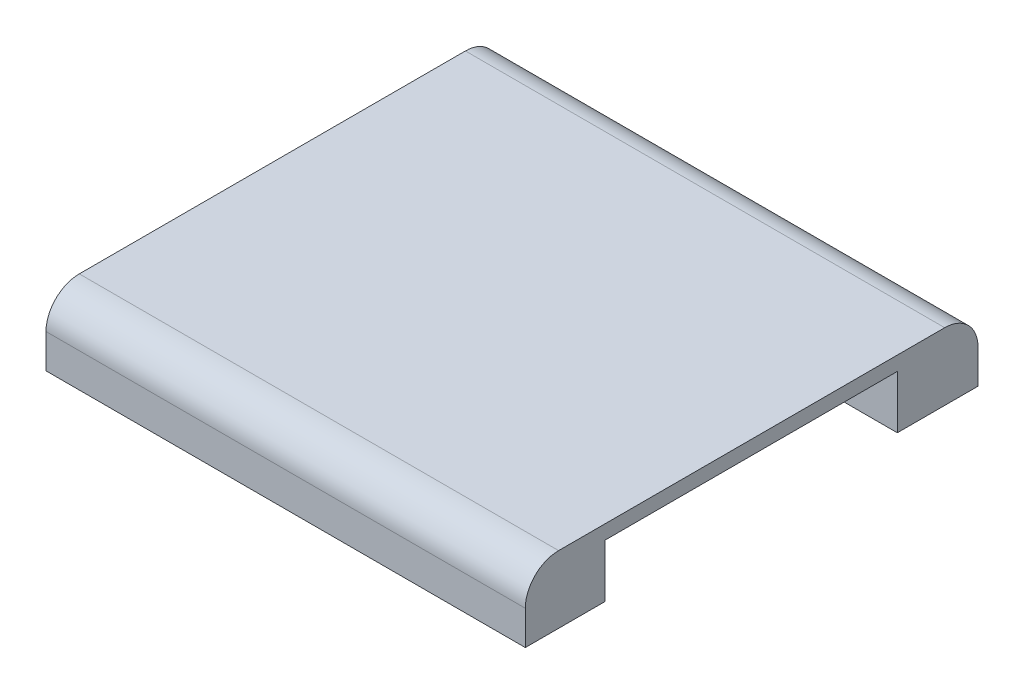
ISO-10303-21;
HEADER;
FILE_DESCRIPTION(('STEP AP214'),'2;1');
FILE_NAME('part.step','',(''),(''),'','','');
FILE_SCHEMA(('AUTOMOTIVE_DESIGN { 1 0 10303 214 1 1 1 1 }'));
ENDSEC;
DATA;
#1=APPLICATION_CONTEXT('core data for automotive mechanical design processes');
#2=APPLICATION_PROTOCOL_DEFINITION('international standard','automotive_design',2000,#1);
#3=PRODUCT_CONTEXT('',#1,'mechanical');
#4=PRODUCT('Part','Part','',(#3));
#5=PRODUCT_RELATED_PRODUCT_CATEGORY('part','',(#4));
#6=PRODUCT_DEFINITION_FORMATION('','',#4);
#7=PRODUCT_DEFINITION_CONTEXT('part definition',#1,'design');
#8=PRODUCT_DEFINITION('design','',#6,#7);
#9=PRODUCT_DEFINITION_SHAPE('','',#8);
#10=(LENGTH_UNIT() NAMED_UNIT(*) SI_UNIT(.MILLI.,.METRE.));
#11=(NAMED_UNIT(*) PLANE_ANGLE_UNIT() SI_UNIT($,.RADIAN.));
#12=(NAMED_UNIT(*) SI_UNIT($,.STERADIAN.) SOLID_ANGLE_UNIT());
#13=UNCERTAINTY_MEASURE_WITH_UNIT(LENGTH_MEASURE(1.E-05),#10,'distance_accuracy_value','');
#14=(GEOMETRIC_REPRESENTATION_CONTEXT(3) GLOBAL_UNCERTAINTY_ASSIGNED_CONTEXT((#13)) GLOBAL_UNIT_ASSIGNED_CONTEXT((#10,
#11,#12)) REPRESENTATION_CONTEXT('',''));
#15=CARTESIAN_POINT('',(0.,0.,0.));
#16=DIRECTION('',(0.,0.,1.));
#17=DIRECTION('',(1.,0.,0.));
#18=AXIS2_PLACEMENT_3D('',#15,#16,#17);
#19=CARTESIAN_POINT('',(18.,-0.0578125220072959,28.0241501159373));
#20=DIRECTION('',(0.,1.,0.));
#21=DIRECTION('',(0.,0.,1.));
#22=AXIS2_PLACEMENT_3D('',#19,#20,#21);
#23=PLANE('',#22);
#24=DIRECTION('',(0.,0.,-1.));
#25=VECTOR('',#24,1.);
#26=CARTESIAN_POINT('',(-18.,-0.0578125220072959,34.));
#27=LINE('',#26,#25);
#28=CARTESIAN_POINT('',(-18.,-0.0578125220072959,34.));
#29=VERTEX_POINT('',#28);
#30=CARTESIAN_POINT('',(-18.,-0.0578125220072959,28.0241501159373));
#31=VERTEX_POINT('',#30);
#32=EDGE_CURVE('E402',#29,#31,#27,.T.);
#33=ORIENTED_EDGE('',*,*,#32,.T.);
#34=DIRECTION('',(1.,0.,0.));
#35=VECTOR('',#34,1.);
#36=CARTESIAN_POINT('',(-40.325568237644,-0.0578125220072959,28.0241501159373));
#37=LINE('',#36,#35);
#38=CARTESIAN_POINT('',(18.,-0.0578125220072959,28.0241501159373));
#39=VERTEX_POINT('',#38);
#40=EDGE_CURVE('E11',#31,#39,#37,.T.);
#41=ORIENTED_EDGE('',*,*,#40,.T.);
#42=DIRECTION('',(0.,0.,-1.));
#43=VECTOR('',#42,1.);
#44=CARTESIAN_POINT('',(18.,-0.0578125220072959,34.));
#45=LINE('',#44,#43);
#46=CARTESIAN_POINT('',(18.,-0.0578125220072959,34.));
#47=VERTEX_POINT('',#46);
#48=EDGE_CURVE('E51',#47,#39,#45,.T.);
#49=ORIENTED_EDGE('',*,*,#48,.F.);
#50=DIRECTION('',(-1.,0.,0.));
#51=VECTOR('',#50,1.);
#52=CARTESIAN_POINT('',(0.,-0.0578125220072959,34.));
#53=LINE('',#52,#51);
#54=EDGE_CURVE('E401',#47,#29,#53,.T.);
#55=ORIENTED_EDGE('',*,*,#54,.T.);
#56=EDGE_LOOP('',(#33,#41,#49,#55));
#57=FACE_BOUND('',#56,.T.);
#58=DIRECTION('',(0.,0.,-1.));
#59=VECTOR('',#58,1.);
#60=CARTESIAN_POINT('',(17.,-0.0578125220072959,34.));
#61=LINE('',#60,#59);
#62=CARTESIAN_POINT('',(17.,-0.0578125220072959,33.));
#63=VERTEX_POINT('',#62);
#64=CARTESIAN_POINT('',(17.,-0.0578125220072959,28.1128841797272));
#65=VERTEX_POINT('',#64);
#66=EDGE_CURVE('E433',#63,#65,#61,.T.);
#67=ORIENTED_EDGE('',*,*,#66,.T.);
#68=DIRECTION('',(1.,0.,0.));
#69=VECTOR('',#68,1.);
#70=CARTESIAN_POINT('',(42.7386337284101,-0.0578125220072959,28.1128841797272));
#71=LINE('',#70,#69);
#72=CARTESIAN_POINT('',(-17.,-0.0578125220072959,28.1128841797272));
#73=VERTEX_POINT('',#72);
#74=EDGE_CURVE('E406',#73,#65,#71,.T.);
#75=ORIENTED_EDGE('',*,*,#74,.F.);
#76=DIRECTION('',(0.,0.,-1.));
#77=VECTOR('',#76,1.);
#78=CARTESIAN_POINT('',(-17.,-0.0578125220072959,34.));
#79=LINE('',#78,#77);
#80=CARTESIAN_POINT('',(-17.,-0.0578125220072959,33.));
#81=VERTEX_POINT('',#80);
#82=EDGE_CURVE('E416',#81,#73,#79,.T.);
#83=ORIENTED_EDGE('',*,*,#82,.F.);
#84=DIRECTION('',(-1.,0.,0.));
#85=VECTOR('',#84,1.);
#86=CARTESIAN_POINT('',(0.,-0.0578125220072959,33.));
#87=LINE('',#86,#85);
#88=CARTESIAN_POINT('',(7.80627689891058,-0.0578125220072959,33.));
#89=VERTEX_POINT('',#88);
#90=EDGE_CURVE('E417',#89,#81,#87,.T.);
#91=ORIENTED_EDGE('',*,*,#90,.F.);
#92=DIRECTION('',(-0.707040858821482,0.,0.707172697406356));
#93=VECTOR('',#92,1.);
#94=CARTESIAN_POINT('',(7.80627689891058,-0.0578125220072959,33.));
#95=LINE('',#94,#93);
#96=CARTESIAN_POINT('',(7.83796469042223,-0.0578125220072959,32.9683062998148));
#97=VERTEX_POINT('',#96);
#98=EDGE_CURVE('E397',#97,#89,#95,.T.);
#99=ORIENTED_EDGE('',*,*,#98,.F.);
#100=DIRECTION('',(1.,0.,0.));
#101=VECTOR('',#100,1.);
#102=CARTESIAN_POINT('',(13.9400122350262,-0.0578125220072959,32.9683062998148));
#103=LINE('',#102,#101);
#104=CARTESIAN_POINT('',(4.85968181109299,-0.0578125220072959,32.9683062998148));
#105=VERTEX_POINT('',#104);
#106=EDGE_CURVE('E413',#105,#97,#103,.T.);
#107=ORIENTED_EDGE('',*,*,#106,.F.);
#108=DIRECTION('',(-0.68267317744641,0.,0.73072384167702));
#109=VECTOR('',#108,1.);
#110=CARTESIAN_POINT('',(4.85968181109299,-0.0578125220072959,32.9683062998148));
#111=LINE('',#110,#109);
#112=CARTESIAN_POINT('',(7.40340874838498,-0.0578125220072959,30.2455364866692));
#113=VERTEX_POINT('',#112);
#114=EDGE_CURVE('E420',#113,#105,#111,.T.);
#115=ORIENTED_EDGE('',*,*,#114,.F.);
#116=DIRECTION('',(-1.,0.,0.));
#117=VECTOR('',#116,1.);
#118=CARTESIAN_POINT('',(12.3591776077276,-0.0578125220072959,30.2455364866692));
#119=LINE('',#118,#117);
#120=CARTESIAN_POINT('',(13.9400122350262,-0.0578125220072959,30.2455364866692));
#121=VERTEX_POINT('',#120);
#122=EDGE_CURVE('E423',#121,#113,#119,.T.);
#123=ORIENTED_EDGE('',*,*,#122,.F.);
#124=DIRECTION('',(0.,0.,-1.));
#125=VECTOR('',#124,1.);
#126=CARTESIAN_POINT('',(13.9400122350262,-0.0578125220072959,30.2455364866692));
#127=LINE('',#126,#125);
#128=CARTESIAN_POINT('',(13.9400122350262,-0.0578125220072959,32.9683062998148));
#129=VERTEX_POINT('',#128);
#130=EDGE_CURVE('E422',#129,#121,#127,.T.);
#131=ORIENTED_EDGE('',*,*,#130,.F.);
#132=DIRECTION('',(1.,0.,0.));
#133=VECTOR('',#132,1.);
#134=CARTESIAN_POINT('',(13.9400122350262,-0.0578125220072959,32.9683062998148));
#135=LINE('',#134,#133);
#136=CARTESIAN_POINT('',(11.5237850289689,-0.0578125220072959,32.9683062998148));
#137=VERTEX_POINT('',#136);
#138=EDGE_CURVE('E415',#137,#129,#135,.T.);
#139=ORIENTED_EDGE('',*,*,#138,.F.);
#140=DIRECTION('',(0.,0.,-1.));
#141=VECTOR('',#140,1.);
#142=CARTESIAN_POINT('',(11.5237850289689,-0.0578125220072959,31.9372937490459));
#143=LINE('',#142,#141);
#144=CARTESIAN_POINT('',(11.5237850289689,-0.0578125220072959,33.));
#145=VERTEX_POINT('',#144);
#146=EDGE_CURVE('E412',#145,#137,#143,.T.);
#147=ORIENTED_EDGE('',*,*,#146,.F.);
#148=DIRECTION('',(-1.,0.,0.));
#149=VECTOR('',#148,1.);
#150=CARTESIAN_POINT('',(0.,-0.0578125220072959,33.));
#151=LINE('',#150,#149);
#152=EDGE_CURVE('E419',#63,#145,#151,.T.);
#153=ORIENTED_EDGE('',*,*,#152,.F.);
#154=EDGE_LOOP('',(#67,#75,#83,#91,#99,#107,#115,#123,#131,#139,#147,#153));
#155=FACE_BOUND('',#154,.T.);
#156=ADVANCED_FACE('F34',(#57,#155),#23,.F.);
#157=DIRECTION('',(1.,0.,0.));
#158=VECTOR('',#157,1.);
#159=CARTESIAN_POINT('',(-40.325568237644,-0.0578125220072959,6.05869530103713));
#160=LINE('',#159,#158);
#161=CARTESIAN_POINT('',(-18.,-0.0578125220072959,6.05869530103713));
#162=VERTEX_POINT('',#161);
#163=CARTESIAN_POINT('',(18.,-0.0578125220072959,6.05869530103713));
#164=VERTEX_POINT('',#163);
#165=EDGE_CURVE('E252',#162,#164,#160,.T.);
#166=ORIENTED_EDGE('',*,*,#165,.F.);
#167=CARTESIAN_POINT('',(-18.,-0.0578125220072959,0.));
#168=VERTEX_POINT('',#167);
#169=EDGE_CURVE('E398',#162,#168,#27,.T.);
#170=ORIENTED_EDGE('',*,*,#169,.T.);
#171=DIRECTION('',(-1.,0.,0.));
#172=VECTOR('',#171,1.);
#173=CARTESIAN_POINT('',(0.,-0.0578125220072959,0.));
#174=LINE('',#173,#172);
#175=CARTESIAN_POINT('',(18.,-0.0578125220072959,0.));
#176=VERTEX_POINT('',#175);
#177=EDGE_CURVE('E403',#176,#168,#174,.T.);
#178=ORIENTED_EDGE('',*,*,#177,.F.);
#179=EDGE_CURVE('E405',#164,#176,#45,.T.);
#180=ORIENTED_EDGE('',*,*,#179,.F.);
#181=EDGE_LOOP('',(#166,#170,#178,#180));
#182=FACE_BOUND('',#181,.T.);
#183=DIRECTION('',(-1.,0.,0.));
#184=VECTOR('',#183,1.);
#185=CARTESIAN_POINT('',(42.7386337284101,-0.0578125220072959,4.11288417972719));
#186=LINE('',#185,#184);
#187=CARTESIAN_POINT('',(17.,-0.0578125220072959,4.11288417972719));
#188=VERTEX_POINT('',#187);
#189=CARTESIAN_POINT('',(-17.,-0.0578125220072959,4.11288417972719));
#190=VERTEX_POINT('',#189);
#191=EDGE_CURVE('E38',#188,#190,#186,.T.);
#192=ORIENTED_EDGE('',*,*,#191,.F.);
#193=CARTESIAN_POINT('',(17.,-0.0578125220072959,1.));
#194=VERTEX_POINT('',#193);
#195=EDGE_CURVE('E429',#188,#194,#61,.T.);
#196=ORIENTED_EDGE('',*,*,#195,.T.);
#197=DIRECTION('',(-1.,0.,0.));
#198=VECTOR('',#197,1.);
#199=CARTESIAN_POINT('',(0.,-0.0578125220072959,1.));
#200=LINE('',#199,#198);
#201=CARTESIAN_POINT('',(2.52238131463829,-0.0578125220072959,1.));
#202=VERTEX_POINT('',#201);
#203=EDGE_CURVE('E443',#194,#202,#200,.T.);
#204=ORIENTED_EDGE('',*,*,#203,.T.);
#205=DIRECTION('',(-0.756635368845266,0.,0.653837073445968));
#206=VECTOR('',#205,1.);
#207=CARTESIAN_POINT('',(2.54458171045212,-0.0578125220072959,0.980815803191426));
#208=LINE('',#207,#206);
#209=CARTESIAN_POINT('',(-0.105019187153202,-0.0578125220072959,3.27043556988826));
#210=VERTEX_POINT('',#209);
#211=EDGE_CURVE('E410',#202,#210,#208,.T.);
#212=ORIENTED_EDGE('',*,*,#211,.T.);
#213=DIRECTION('',(-1.,0.,0.));
#214=VECTOR('',#213,1.);
#215=CARTESIAN_POINT('',(-0.105019187153202,-0.0578125220072959,3.27043556988826));
#216=LINE('',#215,#214);
#217=CARTESIAN_POINT('',(-3.68350976570056,-0.0578125220072959,3.27043556988826));
#218=VERTEX_POINT('',#217);
#219=EDGE_CURVE('E438',#210,#218,#216,.T.);
#220=ORIENTED_EDGE('',*,*,#219,.T.);
#221=DIRECTION('',(-0.653837073445968,0.,-0.756635368845266));
#222=VECTOR('',#221,1.);
#223=CARTESIAN_POINT('',(-3.68350976570056,-0.0578125220072959,3.27043556988826));
#224=LINE('',#223,#222);
#225=CARTESIAN_POINT('',(-5.64547851523037,-0.0578125220072959,1.));
#226=VERTEX_POINT('',#225);
#227=EDGE_CURVE('E43',#218,#226,#224,.T.);
#228=ORIENTED_EDGE('',*,*,#227,.T.);
#229=DIRECTION('',(-1.,0.,0.));
#230=VECTOR('',#229,1.);
#231=CARTESIAN_POINT('',(0.,-0.0578125220072959,1.));
#232=LINE('',#231,#230);
#233=CARTESIAN_POINT('',(-17.,-0.0578125220072959,1.));
#234=VERTEX_POINT('',#233);
#235=EDGE_CURVE('E432',#226,#234,#232,.T.);
#236=ORIENTED_EDGE('',*,*,#235,.T.);
#237=EDGE_CURVE('E408',#190,#234,#79,.T.);
#238=ORIENTED_EDGE('',*,*,#237,.F.);
#239=EDGE_LOOP('',(#192,#196,#204,#212,#220,#228,#236,#238));
#240=FACE_BOUND('',#239,.T.);
#241=ADVANCED_FACE('F36',(#182,#240),#23,.F.);
#242=CARTESIAN_POINT('',(-18.,5.,34.));
#243=DIRECTION('',(0.,1.,0.));
#244=DIRECTION('',(0.,0.,1.));
#245=AXIS2_PLACEMENT_3D('',#242,#243,#244);
#246=PLANE('',#245);
#247=DIRECTION('',(0.,0.,-1.));
#248=VECTOR('',#247,1.);
#249=CARTESIAN_POINT('',(18.,5.,34.));
#250=LINE('',#249,#248);
#251=CARTESIAN_POINT('',(18.,5.,31.5));
#252=VERTEX_POINT('',#251);
#253=CARTESIAN_POINT('',(18.,5.,2.5));
#254=VERTEX_POINT('',#253);
#255=EDGE_CURVE('E357',#252,#254,#250,.T.);
#256=ORIENTED_EDGE('',*,*,#255,.T.);
#257=DIRECTION('',(-1.,0.,0.));
#258=VECTOR('',#257,1.);
#259=CARTESIAN_POINT('',(-18.,5.,2.5));
#260=LINE('',#259,#258);
#261=CARTESIAN_POINT('',(-18.,5.,2.5));
#262=VERTEX_POINT('',#261);
#263=EDGE_CURVE('E386',#254,#262,#260,.T.);
#264=ORIENTED_EDGE('',*,*,#263,.T.);
#265=DIRECTION('',(0.,0.,-1.));
#266=VECTOR('',#265,1.);
#267=CARTESIAN_POINT('',(-18.,5.,34.));
#268=LINE('',#267,#266);
#269=CARTESIAN_POINT('',(-18.,5.,31.5));
#270=VERTEX_POINT('',#269);
#271=EDGE_CURVE('E360',#270,#262,#268,.T.);
#272=ORIENTED_EDGE('',*,*,#271,.F.);
#273=DIRECTION('',(1.,0.,0.));
#274=VECTOR('',#273,1.);
#275=CARTESIAN_POINT('',(-18.,5.,31.5));
#276=LINE('',#275,#274);
#277=EDGE_CURVE('E370',#270,#252,#276,.T.);
#278=ORIENTED_EDGE('',*,*,#277,.T.);
#279=EDGE_LOOP('',(#256,#264,#272,#278));
#280=FACE_BOUND('',#279,.T.);
#281=ADVANCED_FACE('F493',(#280),#246,.T.);
#282=CARTESIAN_POINT('',(-18.,2.5,31.5));
#283=DIRECTION('',(1.,0.,0.));
#284=DIRECTION('',(0.,0.,-1.));
#285=AXIS2_PLACEMENT_3D('',#282,#283,#284);
#286=CYLINDRICAL_SURFACE('',#285,2.5);
#287=ORIENTED_EDGE('',*,*,#277,.F.);
#288=CARTESIAN_POINT('',(-18.,2.5,31.5));
#289=DIRECTION('',(-1.,0.,0.));
#290=DIRECTION('',(0.,-1.,0.));
#291=AXIS2_PLACEMENT_3D('',#288,#289,#290);
#292=CIRCLE('',#291,2.5);
#293=CARTESIAN_POINT('',(-18.,2.5,34.));
#294=VERTEX_POINT('',#293);
#295=EDGE_CURVE('E376',#294,#270,#292,.T.);
#296=ORIENTED_EDGE('',*,*,#295,.F.);
#297=DIRECTION('',(1.,0.,0.));
#298=VECTOR('',#297,1.);
#299=CARTESIAN_POINT('',(0.,2.5,34.));
#300=LINE('',#299,#298);
#301=CARTESIAN_POINT('',(18.,2.5,34.));
#302=VERTEX_POINT('',#301);
#303=EDGE_CURVE('E373',#302,#294,#300,.F.);
#304=ORIENTED_EDGE('',*,*,#303,.F.);
#305=CARTESIAN_POINT('',(18.,2.5,31.5));
#306=DIRECTION('',(-1.,0.,0.));
#307=DIRECTION('',(0.,0.,1.));
#308=AXIS2_PLACEMENT_3D('',#305,#306,#307);
#309=CIRCLE('',#308,2.5);
#310=EDGE_CURVE('E378',#252,#302,#309,.F.);
#311=ORIENTED_EDGE('',*,*,#310,.F.);
#312=EDGE_LOOP('',(#287,#296,#304,#311));
#313=FACE_BOUND('',#312,.T.);
#314=ADVANCED_FACE('F608',(#313),#286,.T.);
#315=CARTESIAN_POINT('',(-18.,2.5,2.5));
#316=DIRECTION('',(1.,0.,0.));
#317=DIRECTION('',(0.,0.,-1.));
#318=AXIS2_PLACEMENT_3D('',#315,#316,#317);
#319=CYLINDRICAL_SURFACE('',#318,2.5);
#320=ORIENTED_EDGE('',*,*,#263,.F.);
#321=CARTESIAN_POINT('',(18.,2.5,2.5));
#322=DIRECTION('',(-1.,0.,0.));
#323=DIRECTION('',(0.,0.,1.));
#324=AXIS2_PLACEMENT_3D('',#321,#322,#323);
#325=CIRCLE('',#324,2.5);
#326=CARTESIAN_POINT('',(18.,2.5,0.));
#327=VERTEX_POINT('',#326);
#328=EDGE_CURVE('E392',#327,#254,#325,.F.);
#329=ORIENTED_EDGE('',*,*,#328,.F.);
#330=DIRECTION('',(-1.,0.,0.));
#331=VECTOR('',#330,1.);
#332=CARTESIAN_POINT('',(-18.,2.5,0.));
#333=LINE('',#332,#331);
#334=CARTESIAN_POINT('',(-18.,2.5,0.));
#335=VERTEX_POINT('',#334);
#336=EDGE_CURVE('E389',#335,#327,#333,.F.);
#337=ORIENTED_EDGE('',*,*,#336,.F.);
#338=CARTESIAN_POINT('',(-18.,2.5,2.5));
#339=DIRECTION('',(-1.,0.,0.));
#340=DIRECTION('',(0.,-1.,0.));
#341=AXIS2_PLACEMENT_3D('',#338,#339,#340);
#342=CIRCLE('',#341,2.5);
#343=EDGE_CURVE('E394',#262,#335,#342,.T.);
#344=ORIENTED_EDGE('',*,*,#343,.F.);
#345=EDGE_LOOP('',(#320,#329,#337,#344));
#346=FACE_BOUND('',#345,.T.);
#347=ADVANCED_FACE('F602',(#346),#319,.T.);
#348=CARTESIAN_POINT('',(-18.,-5.,34.));
#349=DIRECTION('',(-1.,0.,0.));
#350=DIRECTION('',(0.,-1.,0.));
#351=AXIS2_PLACEMENT_3D('',#348,#349,#350);
#352=PLANE('',#351);
#353=ORIENTED_EDGE('',*,*,#32,.F.);
#354=DIRECTION('',(0.,1.,0.));
#355=VECTOR('',#354,1.);
#356=CARTESIAN_POINT('',(-18.,-5.,34.));
#357=LINE('',#356,#355);
#358=EDGE_CURVE('E354',#29,#294,#357,.T.);
#359=ORIENTED_EDGE('',*,*,#358,.T.);
#360=ORIENTED_EDGE('',*,*,#295,.T.);
#361=ORIENTED_EDGE('',*,*,#271,.T.);
#362=ORIENTED_EDGE('',*,*,#343,.T.);
#363=DIRECTION('',(0.,1.,0.));
#364=VECTOR('',#363,1.);
#365=CARTESIAN_POINT('',(-18.,-5.,0.));
#366=LINE('',#365,#364);
#367=EDGE_CURVE('E355',#168,#335,#366,.T.);
#368=ORIENTED_EDGE('',*,*,#367,.F.);
#369=ORIENTED_EDGE('',*,*,#169,.F.);
#370=DIRECTION('',(0.,1.,0.));
#371=VECTOR('',#370,1.);
#372=CARTESIAN_POINT('',(-18.,3.93590653524728,6.05869530103713));
#373=LINE('',#372,#371);
#374=CARTESIAN_POINT('',(-18.,3.93590653524727,6.05869530103713));
#375=VERTEX_POINT('',#374);
#376=EDGE_CURVE('E245',#162,#375,#373,.T.);
#377=ORIENTED_EDGE('',*,*,#376,.T.);
#378=DIRECTION('',(0.,0.,1.));
#379=VECTOR('',#378,1.);
#380=CARTESIAN_POINT('',(-18.,3.93590653524727,28.0241501159373));
#381=LINE('',#380,#379);
#382=CARTESIAN_POINT('',(-18.,3.93590653524727,28.0241501159373));
#383=VERTEX_POINT('',#382);
#384=EDGE_CURVE('E240',#375,#383,#381,.T.);
#385=ORIENTED_EDGE('',*,*,#384,.T.);
#386=DIRECTION('',(0.,-1.,0.));
#387=VECTOR('',#386,1.);
#388=CARTESIAN_POINT('',(-18.,3.93590653524728,28.0241501159373));
#389=LINE('',#388,#387);
#390=EDGE_CURVE('E262',#383,#31,#389,.T.);
#391=ORIENTED_EDGE('',*,*,#390,.T.);
#392=EDGE_LOOP('',(#353,#359,#360,#361,#362,#368,#369,#377,#385,#391));
#393=FACE_BOUND('',#392,.T.);
#394=ADVANCED_FACE('F599',(#393),#352,.T.);
#395=CARTESIAN_POINT('',(-40.325568237644,3.93590653524727,28.0241501159373));
#396=DIRECTION('',(0.,1.,0.));
#397=DIRECTION('',(0.,0.,1.));
#398=AXIS2_PLACEMENT_3D('',#395,#396,#397);
#399=PLANE('',#398);
#400=DIRECTION('',(1.,0.,0.));
#401=VECTOR('',#400,1.);
#402=CARTESIAN_POINT('',(-40.325568237644,3.93590653524727,6.05869530103713));
#403=LINE('',#402,#401);
#404=CARTESIAN_POINT('',(18.,3.93590653524727,6.05869530103713));
#405=VERTEX_POINT('',#404);
#406=EDGE_CURVE('E233',#375,#405,#403,.T.);
#407=ORIENTED_EDGE('',*,*,#406,.T.);
#408=DIRECTION('',(0.,0.,-1.));
#409=VECTOR('',#408,1.);
#410=CARTESIAN_POINT('',(18.,3.93590653524727,28.0241501159373));
#411=LINE('',#410,#409);
#412=CARTESIAN_POINT('',(18.,3.93590653524727,28.0241501159373));
#413=VERTEX_POINT('',#412);
#414=EDGE_CURVE('E238',#413,#405,#411,.T.);
#415=ORIENTED_EDGE('',*,*,#414,.F.);
#416=DIRECTION('',(1.,0.,0.));
#417=VECTOR('',#416,1.);
#418=CARTESIAN_POINT('',(-40.325568237644,3.93590653524727,28.0241501159373));
#419=LINE('',#418,#417);
#420=EDGE_CURVE('E260',#383,#413,#419,.T.);
#421=ORIENTED_EDGE('',*,*,#420,.F.);
#422=ORIENTED_EDGE('',*,*,#384,.F.);
#423=EDGE_LOOP('',(#407,#415,#421,#422));
#424=FACE_BOUND('',#423,.T.);
#425=ADVANCED_FACE('F235',(#424),#399,.F.);
#426=CARTESIAN_POINT('',(18.,-5.,34.));
#427=DIRECTION('',(-1.,0.,0.));
#428=DIRECTION('',(0.,0.,1.));
#429=AXIS2_PLACEMENT_3D('',#426,#427,#428);
#430=PLANE('',#429);
#431=DIRECTION('',(0.,1.,0.));
#432=VECTOR('',#431,1.);
#433=CARTESIAN_POINT('',(18.,-5.,34.));
#434=LINE('',#433,#432);
#435=EDGE_CURVE('E352',#47,#302,#434,.T.);
#436=ORIENTED_EDGE('',*,*,#435,.F.);
#437=ORIENTED_EDGE('',*,*,#48,.T.);
#438=DIRECTION('',(0.,1.,0.));
#439=VECTOR('',#438,1.);
#440=CARTESIAN_POINT('',(18.,3.93590653524727,28.0241501159373));
#441=LINE('',#440,#439);
#442=EDGE_CURVE('E255',#39,#413,#441,.T.);
#443=ORIENTED_EDGE('',*,*,#442,.T.);
#444=ORIENTED_EDGE('',*,*,#414,.T.);
#445=DIRECTION('',(0.,-1.,0.));
#446=VECTOR('',#445,1.);
#447=CARTESIAN_POINT('',(18.,3.93590653524727,6.05869530103713));
#448=LINE('',#447,#446);
#449=EDGE_CURVE('E249',#405,#164,#448,.T.);
#450=ORIENTED_EDGE('',*,*,#449,.T.);
#451=ORIENTED_EDGE('',*,*,#179,.T.);
#452=DIRECTION('',(0.,1.,0.));
#453=VECTOR('',#452,1.);
#454=CARTESIAN_POINT('',(18.,-5.,0.));
#455=LINE('',#454,#453);
#456=EDGE_CURVE('E335',#176,#327,#455,.T.);
#457=ORIENTED_EDGE('',*,*,#456,.T.);
#458=ORIENTED_EDGE('',*,*,#328,.T.);
#459=ORIENTED_EDGE('',*,*,#255,.F.);
#460=ORIENTED_EDGE('',*,*,#310,.T.);
#461=EDGE_LOOP('',(#436,#437,#443,#444,#450,#451,#457,#458,#459,#460));
#462=FACE_BOUND('',#461,.T.);
#463=ADVANCED_FACE('F254',(#462),#430,.F.);
#464=CARTESIAN_POINT('',(-40.325568237644,3.93590653524727,6.05869530103713));
#465=DIRECTION('',(0.,0.,-1.));
#466=DIRECTION('',(-1.,0.,0.));
#467=AXIS2_PLACEMENT_3D('',#464,#465,#466);
#468=PLANE('',#467);
#469=ORIENTED_EDGE('',*,*,#165,.T.);
#470=ORIENTED_EDGE('',*,*,#449,.F.);
#471=ORIENTED_EDGE('',*,*,#406,.F.);
#472=ORIENTED_EDGE('',*,*,#376,.F.);
#473=EDGE_LOOP('',(#469,#470,#471,#472));
#474=FACE_BOUND('',#473,.T.);
#475=ADVANCED_FACE('F250',(#474),#468,.F.);
#476=CARTESIAN_POINT('',(-40.325568237644,3.93590653524727,28.0241501159373));
#477=DIRECTION('',(0.,0.,1.));
#478=DIRECTION('',(1.,0.,0.));
#479=AXIS2_PLACEMENT_3D('',#476,#477,#478);
#480=PLANE('',#479);
#481=ORIENTED_EDGE('',*,*,#420,.T.);
#482=ORIENTED_EDGE('',*,*,#442,.F.);
#483=ORIENTED_EDGE('',*,*,#40,.F.);
#484=ORIENTED_EDGE('',*,*,#390,.F.);
#485=EDGE_LOOP('',(#481,#482,#483,#484));
#486=FACE_BOUND('',#485,.T.);
#487=ADVANCED_FACE('F597',(#486),#480,.F.);
#488=CARTESIAN_POINT('',(0.,0.,0.));
#489=DIRECTION('',(0.,0.,1.));
#490=DIRECTION('',(1.,0.,0.));
#491=AXIS2_PLACEMENT_3D('',#488,#489,#490);
#492=PLANE('',#491);
#493=ORIENTED_EDGE('',*,*,#456,.F.);
#494=ORIENTED_EDGE('',*,*,#177,.T.);
#495=ORIENTED_EDGE('',*,*,#367,.T.);
#496=ORIENTED_EDGE('',*,*,#336,.T.);
#497=EDGE_LOOP('',(#493,#494,#495,#496));
#498=FACE_BOUND('',#497,.T.);
#499=ADVANCED_FACE('F581',(#498),#492,.F.);
#500=CARTESIAN_POINT('',(0.,0.,34.));
#501=DIRECTION('',(0.,0.,1.));
#502=DIRECTION('',(1.,0.,0.));
#503=AXIS2_PLACEMENT_3D('',#500,#501,#502);
#504=PLANE('',#503);
#505=ORIENTED_EDGE('',*,*,#54,.F.);
#506=ORIENTED_EDGE('',*,*,#435,.T.);
#507=ORIENTED_EDGE('',*,*,#303,.T.);
#508=ORIENTED_EDGE('',*,*,#358,.F.);
#509=EDGE_LOOP('',(#505,#506,#507,#508));
#510=FACE_BOUND('',#509,.T.);
#511=ADVANCED_FACE('F576',(#510),#504,.T.);
#512=CARTESIAN_POINT('',(-18.,4.,34.));
#513=DIRECTION('',(0.,1.,0.));
#514=DIRECTION('',(0.,0.,1.));
#515=AXIS2_PLACEMENT_3D('',#512,#513,#514);
#516=PLANE('',#515);
#517=DIRECTION('',(0.,0.,-1.));
#518=VECTOR('',#517,1.);
#519=CARTESIAN_POINT('',(11.5237850289689,4.,31.9372937490459));
#520=LINE('',#519,#518);
#521=CARTESIAN_POINT('',(11.5237850289689,4.,33.));
#522=VERTEX_POINT('',#521);
#523=CARTESIAN_POINT('',(11.5237850289689,4.,32.9683062998148));
#524=VERTEX_POINT('',#523);
#525=EDGE_CURVE('E267',#522,#524,#520,.T.);
#526=ORIENTED_EDGE('',*,*,#525,.T.);
#527=DIRECTION('',(-1.,0.,0.));
#528=VECTOR('',#527,1.);
#529=CARTESIAN_POINT('',(13.9400122350262,4.,32.9683062998148));
#530=LINE('',#529,#528);
#531=CARTESIAN_POINT('',(13.9400122350262,4.,32.9683062998148));
#532=VERTEX_POINT('',#531);
#533=EDGE_CURVE('E297',#532,#524,#530,.T.);
#534=ORIENTED_EDGE('',*,*,#533,.F.);
#535=DIRECTION('',(0.,0.,1.));
#536=VECTOR('',#535,1.);
#537=CARTESIAN_POINT('',(13.9400122350262,4.,30.2455364866692));
#538=LINE('',#537,#536);
#539=CARTESIAN_POINT('',(13.9400122350262,4.,30.2455364866692));
#540=VERTEX_POINT('',#539);
#541=EDGE_CURVE('E301',#540,#532,#538,.T.);
#542=ORIENTED_EDGE('',*,*,#541,.F.);
#543=DIRECTION('',(1.,0.,0.));
#544=VECTOR('',#543,1.);
#545=CARTESIAN_POINT('',(12.3591776077276,4.,30.2455364866692));
#546=LINE('',#545,#544);
#547=CARTESIAN_POINT('',(7.40340874838499,4.,30.2455364866692));
#548=VERTEX_POINT('',#547);
#549=EDGE_CURVE('E305',#548,#540,#546,.T.);
#550=ORIENTED_EDGE('',*,*,#549,.F.);
#551=DIRECTION('',(0.68267317744641,0.,-0.73072384167702));
#552=VECTOR('',#551,1.);
#553=CARTESIAN_POINT('',(4.85968181109299,4.,32.9683062998148));
#554=LINE('',#553,#552);
#555=CARTESIAN_POINT('',(4.85968181109299,4.,32.9683062998148));
#556=VERTEX_POINT('',#555);
#557=EDGE_CURVE('E300',#556,#548,#554,.T.);
#558=ORIENTED_EDGE('',*,*,#557,.F.);
#559=CARTESIAN_POINT('',(7.83796469042223,4.,32.9683062998148));
#560=VERTEX_POINT('',#559);
#561=EDGE_CURVE('E295',#560,#556,#530,.T.);
#562=ORIENTED_EDGE('',*,*,#561,.F.);
#563=DIRECTION('',(-0.707040858821482,0.,0.707172697406356));
#564=VECTOR('',#563,1.);
#565=CARTESIAN_POINT('',(7.80627689891058,4.,33.));
#566=LINE('',#565,#564);
#567=CARTESIAN_POINT('',(7.80627689891057,4.,33.));
#568=VERTEX_POINT('',#567);
#569=EDGE_CURVE('E271',#560,#568,#566,.T.);
#570=ORIENTED_EDGE('',*,*,#569,.T.);
#571=DIRECTION('',(1.,0.,0.));
#572=VECTOR('',#571,1.);
#573=CARTESIAN_POINT('',(-18.,4.,33.));
#574=LINE('',#573,#572);
#575=CARTESIAN_POINT('',(-17.,4.,33.));
#576=VERTEX_POINT('',#575);
#577=EDGE_CURVE('E337',#576,#568,#574,.T.);
#578=ORIENTED_EDGE('',*,*,#577,.F.);
#579=DIRECTION('',(0.,0.,-1.));
#580=VECTOR('',#579,1.);
#581=CARTESIAN_POINT('',(-17.,4.,34.));
#582=LINE('',#581,#580);
#583=CARTESIAN_POINT('',(-17.,4.,28.1128841797272));
#584=VERTEX_POINT('',#583);
#585=EDGE_CURVE('E332',#576,#584,#582,.T.);
#586=ORIENTED_EDGE('',*,*,#585,.T.);
#587=DIRECTION('',(-1.,0.,0.));
#588=VECTOR('',#587,1.);
#589=CARTESIAN_POINT('',(-18.,4.,28.1128841797272));
#590=LINE('',#589,#588);
#591=CARTESIAN_POINT('',(17.,4.,28.1128841797272));
#592=VERTEX_POINT('',#591);
#593=EDGE_CURVE('E322',#592,#584,#590,.T.);
#594=ORIENTED_EDGE('',*,*,#593,.F.);
#595=DIRECTION('',(0.,0.,-1.));
#596=VECTOR('',#595,1.);
#597=CARTESIAN_POINT('',(17.,4.,34.));
#598=LINE('',#597,#596);
#599=CARTESIAN_POINT('',(17.,4.,33.));
#600=VERTEX_POINT('',#599);
#601=EDGE_CURVE('E342',#600,#592,#598,.T.);
#602=ORIENTED_EDGE('',*,*,#601,.F.);
#603=EDGE_CURVE('E341',#522,#600,#574,.T.);
#604=ORIENTED_EDGE('',*,*,#603,.F.);
#605=EDGE_LOOP('',(#526,#534,#542,#550,#558,#562,#570,#578,#586,#594,#602,#604));
#606=FACE_BOUND('',#605,.T.);
#607=ADVANCED_FACE('F515',(#606),#516,.F.);
#608=CARTESIAN_POINT('',(0.,0.,33.));
#609=DIRECTION('',(0.,0.,1.));
#610=DIRECTION('',(1.,0.,0.));
#611=AXIS2_PLACEMENT_3D('',#608,#609,#610);
#612=PLANE('',#611);
#613=DIRECTION('',(0.,-1.,0.));
#614=VECTOR('',#613,1.);
#615=CARTESIAN_POINT('',(7.80627689891058,7.86642099012341,33.));
#616=LINE('',#615,#614);
#617=EDGE_CURVE('E244',#568,#89,#616,.T.);
#618=ORIENTED_EDGE('',*,*,#617,.T.);
#619=ORIENTED_EDGE('',*,*,#90,.T.);
#620=DIRECTION('',(0.,1.,0.));
#621=VECTOR('',#620,1.);
#622=CARTESIAN_POINT('',(-17.,-5.,33.));
#623=LINE('',#622,#621);
#624=EDGE_CURVE('E348',#81,#576,#623,.T.);
#625=ORIENTED_EDGE('',*,*,#624,.T.);
#626=ORIENTED_EDGE('',*,*,#577,.T.);
#627=EDGE_LOOP('',(#618,#619,#625,#626));
#628=FACE_BOUND('',#627,.T.);
#629=ADVANCED_FACE('F526',(#628),#612,.F.);
#630=CARTESIAN_POINT('',(13.9400122350262,-3.2,32.9683062998148));
#631=DIRECTION('',(0.,0.,-1.));
#632=DIRECTION('',(-1.,0.,0.));
#633=AXIS2_PLACEMENT_3D('',#630,#631,#632);
#634=PLANE('',#633);
#635=DIRECTION('',(0.,1.,0.));
#636=VECTOR('',#635,1.);
#637=CARTESIAN_POINT('',(4.85968181109299,-3.2,32.9683062998148));
#638=LINE('',#637,#636);
#639=EDGE_CURVE('E313',#105,#556,#638,.T.);
#640=ORIENTED_EDGE('',*,*,#639,.F.);
#641=ORIENTED_EDGE('',*,*,#106,.T.);
#642=DIRECTION('',(0.,-1.,0.));
#643=VECTOR('',#642,1.);
#644=CARTESIAN_POINT('',(7.83796469042223,-3.2,32.9683062998148));
#645=LINE('',#644,#643);
#646=EDGE_CURVE('E270',#560,#97,#645,.T.);
#647=ORIENTED_EDGE('',*,*,#646,.F.);
#648=ORIENTED_EDGE('',*,*,#561,.T.);
#649=EDGE_LOOP('',(#640,#641,#647,#648));
#650=FACE_BOUND('',#649,.T.);
#651=ADVANCED_FACE('F536',(#650),#634,.F.);
#652=CARTESIAN_POINT('',(7.80627689891058,7.86642099012341,33.));
#653=DIRECTION('',(0.707172697406356,0.,0.707040858821482));
#654=DIRECTION('',(0.707040858821482,0.,-0.707172697406356));
#655=AXIS2_PLACEMENT_3D('',#652,#653,#654);
#656=PLANE('',#655);
#657=ORIENTED_EDGE('',*,*,#646,.T.);
#658=ORIENTED_EDGE('',*,*,#98,.T.);
#659=ORIENTED_EDGE('',*,*,#617,.F.);
#660=ORIENTED_EDGE('',*,*,#569,.F.);
#661=EDGE_LOOP('',(#657,#658,#659,#660));
#662=FACE_BOUND('',#661,.T.);
#663=ADVANCED_FACE('F528',(#662),#656,.F.);
#664=DIRECTION('',(0.,1.,0.));
#665=VECTOR('',#664,1.);
#666=CARTESIAN_POINT('',(11.5237850289689,-3.2,32.9683062998148));
#667=LINE('',#666,#665);
#668=EDGE_CURVE('E281',#137,#524,#667,.T.);
#669=ORIENTED_EDGE('',*,*,#668,.F.);
#670=ORIENTED_EDGE('',*,*,#138,.T.);
#671=DIRECTION('',(0.,1.,0.));
#672=VECTOR('',#671,1.);
#673=CARTESIAN_POINT('',(13.9400122350262,-3.2,32.9683062998148));
#674=LINE('',#673,#672);
#675=EDGE_CURVE('E315',#129,#532,#674,.T.);
#676=ORIENTED_EDGE('',*,*,#675,.T.);
#677=ORIENTED_EDGE('',*,*,#533,.T.);
#678=EDGE_LOOP('',(#669,#670,#676,#677));
#679=FACE_BOUND('',#678,.T.);
#680=ADVANCED_FACE('F554',(#679),#634,.F.);
#681=DIRECTION('',(0.,1.,0.));
#682=VECTOR('',#681,1.);
#683=CARTESIAN_POINT('',(17.,-5.,33.));
#684=LINE('',#683,#682);
#685=EDGE_CURVE('E340',#63,#600,#684,.T.);
#686=ORIENTED_EDGE('',*,*,#685,.F.);
#687=ORIENTED_EDGE('',*,*,#152,.T.);
#688=DIRECTION('',(0.,-1.,0.));
#689=VECTOR('',#688,1.);
#690=CARTESIAN_POINT('',(11.5237850289689,7.86642099012341,33.));
#691=LINE('',#690,#689);
#692=EDGE_CURVE('E274',#522,#145,#691,.T.);
#693=ORIENTED_EDGE('',*,*,#692,.F.);
#694=ORIENTED_EDGE('',*,*,#603,.T.);
#695=EDGE_LOOP('',(#686,#687,#693,#694));
#696=FACE_BOUND('',#695,.T.);
#697=ADVANCED_FACE('F560',(#696),#612,.F.);
#698=CARTESIAN_POINT('',(11.5237850289689,7.86642099012341,31.9372937490459));
#699=DIRECTION('',(-1.,0.,0.));
#700=DIRECTION('',(0.,0.,1.));
#701=AXIS2_PLACEMENT_3D('',#698,#699,#700);
#702=PLANE('',#701);
#703=ORIENTED_EDGE('',*,*,#692,.T.);
#704=ORIENTED_EDGE('',*,*,#146,.T.);
#705=ORIENTED_EDGE('',*,*,#668,.T.);
#706=ORIENTED_EDGE('',*,*,#525,.F.);
#707=EDGE_LOOP('',(#703,#704,#705,#706));
#708=FACE_BOUND('',#707,.T.);
#709=ADVANCED_FACE('F556',(#708),#702,.F.);
#710=CARTESIAN_POINT('',(4.85968181109299,-3.2,32.9683062998148));
#711=DIRECTION('',(0.73072384167702,0.,0.68267317744641));
#712=DIRECTION('',(0.68267317744641,0.,-0.73072384167702));
#713=AXIS2_PLACEMENT_3D('',#710,#711,#712);
#714=PLANE('',#713);
#715=DIRECTION('',(0.,1.,0.));
#716=VECTOR('',#715,1.);
#717=CARTESIAN_POINT('',(7.40340874838498,-3.2,30.2455364866692));
#718=LINE('',#717,#716);
#719=EDGE_CURVE('E311',#113,#548,#718,.T.);
#720=ORIENTED_EDGE('',*,*,#719,.F.);
#721=ORIENTED_EDGE('',*,*,#114,.T.);
#722=ORIENTED_EDGE('',*,*,#639,.T.);
#723=ORIENTED_EDGE('',*,*,#557,.T.);
#724=EDGE_LOOP('',(#720,#721,#722,#723));
#725=FACE_BOUND('',#724,.T.);
#726=ADVANCED_FACE('F543',(#725),#714,.F.);
#727=CARTESIAN_POINT('',(13.9400122350262,-3.2,30.2455364866692));
#728=DIRECTION('',(-1.,0.,0.));
#729=DIRECTION('',(0.,0.,1.));
#730=AXIS2_PLACEMENT_3D('',#727,#728,#729);
#731=PLANE('',#730);
#732=ORIENTED_EDGE('',*,*,#675,.F.);
#733=ORIENTED_EDGE('',*,*,#130,.T.);
#734=DIRECTION('',(0.,1.,0.));
#735=VECTOR('',#734,1.);
#736=CARTESIAN_POINT('',(13.9400122350262,-3.2,30.2455364866692));
#737=LINE('',#736,#735);
#738=EDGE_CURVE('E304',#121,#540,#737,.T.);
#739=ORIENTED_EDGE('',*,*,#738,.T.);
#740=ORIENTED_EDGE('',*,*,#541,.T.);
#741=EDGE_LOOP('',(#732,#733,#739,#740));
#742=FACE_BOUND('',#741,.T.);
#743=ADVANCED_FACE('F550',(#742),#731,.F.);
#744=CARTESIAN_POINT('',(12.3591776077276,-3.2,30.2455364866692));
#745=DIRECTION('',(0.,0.,1.));
#746=DIRECTION('',(1.,0.,0.));
#747=AXIS2_PLACEMENT_3D('',#744,#745,#746);
#748=PLANE('',#747);
#749=ORIENTED_EDGE('',*,*,#738,.F.);
#750=ORIENTED_EDGE('',*,*,#122,.T.);
#751=ORIENTED_EDGE('',*,*,#719,.T.);
#752=ORIENTED_EDGE('',*,*,#549,.T.);
#753=EDGE_LOOP('',(#749,#750,#751,#752));
#754=FACE_BOUND('',#753,.T.);
#755=ADVANCED_FACE('F545',(#754),#748,.F.);
#756=CARTESIAN_POINT('',(17.,-5.,34.));
#757=DIRECTION('',(-1.,0.,0.));
#758=DIRECTION('',(0.,0.,1.));
#759=AXIS2_PLACEMENT_3D('',#756,#757,#758);
#760=PLANE('',#759);
#761=ORIENTED_EDGE('',*,*,#66,.F.);
#762=ORIENTED_EDGE('',*,*,#685,.T.);
#763=ORIENTED_EDGE('',*,*,#601,.T.);
#764=DIRECTION('',(0.,-1.,0.));
#765=VECTOR('',#764,1.);
#766=CARTESIAN_POINT('',(17.,-5.,28.1128841797272));
#767=LINE('',#766,#765);
#768=EDGE_CURVE('E367',#592,#65,#767,.T.);
#769=ORIENTED_EDGE('',*,*,#768,.T.);
#770=EDGE_LOOP('',(#761,#762,#763,#769));
#771=FACE_BOUND('',#770,.T.);
#772=ADVANCED_FACE('F508',(#771),#760,.T.);
#773=CARTESIAN_POINT('',(-17.,-5.,34.));
#774=DIRECTION('',(-1.,0.,0.));
#775=DIRECTION('',(0.,-1.,0.));
#776=AXIS2_PLACEMENT_3D('',#773,#774,#775);
#777=PLANE('',#776);
#778=ORIENTED_EDGE('',*,*,#624,.F.);
#779=ORIENTED_EDGE('',*,*,#82,.T.);
#780=DIRECTION('',(0.,-1.,0.));
#781=VECTOR('',#780,1.);
#782=CARTESIAN_POINT('',(-17.,-5.,28.1128841797272));
#783=LINE('',#782,#781);
#784=EDGE_CURVE('E324',#584,#73,#783,.T.);
#785=ORIENTED_EDGE('',*,*,#784,.F.);
#786=ORIENTED_EDGE('',*,*,#585,.F.);
#787=EDGE_LOOP('',(#778,#779,#785,#786));
#788=FACE_BOUND('',#787,.T.);
#789=ADVANCED_FACE('F521',(#788),#777,.F.);
#790=CARTESIAN_POINT('',(42.7386337284101,4.9999998957025,28.1128841797272));
#791=DIRECTION('',(0.,0.,-1.));
#792=DIRECTION('',(-1.,0.,0.));
#793=AXIS2_PLACEMENT_3D('',#790,#791,#792);
#794=PLANE('',#793);
#795=ORIENTED_EDGE('',*,*,#784,.T.);
#796=ORIENTED_EDGE('',*,*,#74,.T.);
#797=ORIENTED_EDGE('',*,*,#768,.F.);
#798=ORIENTED_EDGE('',*,*,#593,.T.);
#799=EDGE_LOOP('',(#795,#796,#797,#798));
#800=FACE_BOUND('',#799,.T.);
#801=ADVANCED_FACE('F512',(#800),#794,.F.);
#802=ORIENTED_EDGE('',*,*,#195,.F.);
#803=DIRECTION('',(0.,1.,0.));
#804=VECTOR('',#803,1.);
#805=CARTESIAN_POINT('',(17.,-4.99999999999999,4.11288417972719));
#806=LINE('',#805,#804);
#807=CARTESIAN_POINT('',(17.,4.,4.11288417972719));
#808=VERTEX_POINT('',#807);
#809=EDGE_CURVE('E363',#188,#808,#806,.T.);
#810=ORIENTED_EDGE('',*,*,#809,.T.);
#811=CARTESIAN_POINT('',(17.,4.,1.));
#812=VERTEX_POINT('',#811);
#813=EDGE_CURVE('E345',#808,#812,#598,.T.);
#814=ORIENTED_EDGE('',*,*,#813,.T.);
#815=DIRECTION('',(0.,1.,0.));
#816=VECTOR('',#815,1.);
#817=CARTESIAN_POINT('',(17.,-5.,1.));
#818=LINE('',#817,#816);
#819=EDGE_CURVE('E331',#194,#812,#818,.T.);
#820=ORIENTED_EDGE('',*,*,#819,.F.);
#821=EDGE_LOOP('',(#802,#810,#814,#820));
#822=FACE_BOUND('',#821,.T.);
#823=ADVANCED_FACE('F471',(#822),#760,.T.);
#824=CARTESIAN_POINT('',(0.,0.,1.));
#825=DIRECTION('',(0.,0.,1.));
#826=DIRECTION('',(1.,0.,0.));
#827=AXIS2_PLACEMENT_3D('',#824,#825,#826);
#828=PLANE('',#827);
#829=ORIENTED_EDGE('',*,*,#235,.F.);
#830=DIRECTION('',(0.,-1.,0.));
#831=VECTOR('',#830,1.);
#832=CARTESIAN_POINT('',(-5.64547851523037,0.,1.));
#833=LINE('',#832,#831);
#834=CARTESIAN_POINT('',(-5.64547851523037,4.,1.));
#835=VERTEX_POINT('',#834);
#836=EDGE_CURVE('E381',#835,#226,#833,.T.);
#837=ORIENTED_EDGE('',*,*,#836,.F.);
#838=DIRECTION('',(1.,0.,0.));
#839=VECTOR('',#838,1.);
#840=CARTESIAN_POINT('',(-18.,4.,1.));
#841=LINE('',#840,#839);
#842=CARTESIAN_POINT('',(-17.,4.,1.));
#843=VERTEX_POINT('',#842);
#844=EDGE_CURVE('E328',#843,#835,#841,.T.);
#845=ORIENTED_EDGE('',*,*,#844,.F.);
#846=DIRECTION('',(0.,1.,0.));
#847=VECTOR('',#846,1.);
#848=CARTESIAN_POINT('',(-17.,-5.,1.));
#849=LINE('',#848,#847);
#850=EDGE_CURVE('E346',#234,#843,#849,.T.);
#851=ORIENTED_EDGE('',*,*,#850,.F.);
#852=EDGE_LOOP('',(#829,#837,#845,#851));
#853=FACE_BOUND('',#852,.T.);
#854=ADVANCED_FACE('F453',(#853),#828,.T.);
#855=ORIENTED_EDGE('',*,*,#203,.F.);
#856=ORIENTED_EDGE('',*,*,#819,.T.);
#857=CARTESIAN_POINT('',(2.52238131463829,4.,1.));
#858=VERTEX_POINT('',#857);
#859=EDGE_CURVE('E327',#858,#812,#841,.T.);
#860=ORIENTED_EDGE('',*,*,#859,.F.);
#861=DIRECTION('',(0.,1.,0.));
#862=VECTOR('',#861,1.);
#863=CARTESIAN_POINT('',(2.52238131463829,0.,1.));
#864=LINE('',#863,#862);
#865=EDGE_CURVE('E384',#202,#858,#864,.T.);
#866=ORIENTED_EDGE('',*,*,#865,.F.);
#867=EDGE_LOOP('',(#855,#856,#860,#866));
#868=FACE_BOUND('',#867,.T.);
#869=ADVANCED_FACE('F474',(#868),#828,.T.);
#870=DIRECTION('',(1.,0.,0.));
#871=VECTOR('',#870,1.);
#872=CARTESIAN_POINT('',(-0.105019187153202,4.,3.27043556988826));
#873=LINE('',#872,#871);
#874=CARTESIAN_POINT('',(-3.68350976570056,4.,3.27043556988826));
#875=VERTEX_POINT('',#874);
#876=CARTESIAN_POINT('',(-0.105019187153202,4.,3.27043556988826));
#877=VERTEX_POINT('',#876);
#878=EDGE_CURVE('E284',#875,#877,#873,.T.);
#879=ORIENTED_EDGE('',*,*,#878,.T.);
#880=DIRECTION('',(0.756635368845266,0.,-0.653837073445968));
#881=VECTOR('',#880,1.);
#882=CARTESIAN_POINT('',(2.54458171045212,4.,0.980815803191426));
#883=LINE('',#882,#881);
#884=EDGE_CURVE('E283',#877,#858,#883,.T.);
#885=ORIENTED_EDGE('',*,*,#884,.T.);
#886=ORIENTED_EDGE('',*,*,#859,.T.);
#887=ORIENTED_EDGE('',*,*,#813,.F.);
#888=DIRECTION('',(1.,0.,0.));
#889=VECTOR('',#888,1.);
#890=CARTESIAN_POINT('',(-18.,4.,4.11288417972719));
#891=LINE('',#890,#889);
#892=CARTESIAN_POINT('',(-17.,4.,4.11288417972719));
#893=VERTEX_POINT('',#892);
#894=EDGE_CURVE('E317',#893,#808,#891,.T.);
#895=ORIENTED_EDGE('',*,*,#894,.F.);
#896=EDGE_CURVE('E336',#893,#843,#582,.T.);
#897=ORIENTED_EDGE('',*,*,#896,.T.);
#898=ORIENTED_EDGE('',*,*,#844,.T.);
#899=DIRECTION('',(0.653837073445968,0.,0.756635368845266));
#900=VECTOR('',#899,1.);
#901=CARTESIAN_POINT('',(-3.68350976570056,4.,3.27043556988826));
#902=LINE('',#901,#900);
#903=EDGE_CURVE('E288',#835,#875,#902,.T.);
#904=ORIENTED_EDGE('',*,*,#903,.T.);
#905=EDGE_LOOP('',(#879,#885,#886,#887,#895,#897,#898,#904));
#906=FACE_BOUND('',#905,.T.);
#907=ADVANCED_FACE('F461',(#906),#516,.F.);
#908=DIRECTION('',(0.,1.,0.));
#909=VECTOR('',#908,1.);
#910=CARTESIAN_POINT('',(-17.,-4.99999999999999,4.11288417972719));
#911=LINE('',#910,#909);
#912=EDGE_CURVE('E320',#190,#893,#911,.T.);
#913=ORIENTED_EDGE('',*,*,#912,.F.);
#914=ORIENTED_EDGE('',*,*,#237,.T.);
#915=ORIENTED_EDGE('',*,*,#850,.T.);
#916=ORIENTED_EDGE('',*,*,#896,.F.);
#917=EDGE_LOOP('',(#913,#914,#915,#916));
#918=FACE_BOUND('',#917,.T.);
#919=ADVANCED_FACE('F458',(#918),#777,.F.);
#920=CARTESIAN_POINT('',(42.7386337284101,4.9999998957025,4.11288417972719));
#921=DIRECTION('',(0.,0.,1.));
#922=DIRECTION('',(0.,-1.,0.));
#923=AXIS2_PLACEMENT_3D('',#920,#921,#922);
#924=PLANE('',#923);
#925=ORIENTED_EDGE('',*,*,#809,.F.);
#926=ORIENTED_EDGE('',*,*,#191,.T.);
#927=ORIENTED_EDGE('',*,*,#912,.T.);
#928=ORIENTED_EDGE('',*,*,#894,.T.);
#929=EDGE_LOOP('',(#925,#926,#927,#928));
#930=FACE_BOUND('',#929,.T.);
#931=ADVANCED_FACE('F467',(#930),#924,.F.);
#932=CARTESIAN_POINT('',(2.54458171045212,-3.2,0.980815803191426));
#933=DIRECTION('',(0.653837073445968,0.,0.756635368845266));
#934=DIRECTION('',(0.756635368845266,0.,-0.653837073445968));
#935=AXIS2_PLACEMENT_3D('',#932,#933,#934);
#936=PLANE('',#935);
#937=ORIENTED_EDGE('',*,*,#211,.F.);
#938=ORIENTED_EDGE('',*,*,#865,.T.);
#939=ORIENTED_EDGE('',*,*,#884,.F.);
#940=DIRECTION('',(0.,1.,0.));
#941=VECTOR('',#940,1.);
#942=CARTESIAN_POINT('',(-0.105019187153202,-3.2,3.27043556988826));
#943=LINE('',#942,#941);
#944=EDGE_CURVE('E293',#210,#877,#943,.T.);
#945=ORIENTED_EDGE('',*,*,#944,.F.);
#946=EDGE_LOOP('',(#937,#938,#939,#945));
#947=FACE_BOUND('',#946,.T.);
#948=ADVANCED_FACE('F479',(#947),#936,.T.);
#949=CARTESIAN_POINT('',(-0.105019187153202,-3.2,3.27043556988826));
#950=DIRECTION('',(0.,0.,1.));
#951=DIRECTION('',(1.,0.,0.));
#952=AXIS2_PLACEMENT_3D('',#949,#950,#951);
#953=PLANE('',#952);
#954=ORIENTED_EDGE('',*,*,#219,.F.);
#955=ORIENTED_EDGE('',*,*,#944,.T.);
#956=ORIENTED_EDGE('',*,*,#878,.F.);
#957=DIRECTION('',(0.,1.,0.));
#958=VECTOR('',#957,1.);
#959=CARTESIAN_POINT('',(-3.68350976570056,-3.2,3.27043556988826));
#960=LINE('',#959,#958);
#961=EDGE_CURVE('E287',#218,#875,#960,.T.);
#962=ORIENTED_EDGE('',*,*,#961,.F.);
#963=EDGE_LOOP('',(#954,#955,#956,#962));
#964=FACE_BOUND('',#963,.T.);
#965=ADVANCED_FACE('F482',(#964),#953,.T.);
#966=CARTESIAN_POINT('',(-3.68350976570056,-3.2,3.27043556988826));
#967=DIRECTION('',(-0.756635368845266,0.,0.653837073445968));
#968=DIRECTION('',(0.653837073445968,0.,0.756635368845266));
#969=AXIS2_PLACEMENT_3D('',#966,#967,#968);
#970=PLANE('',#969);
#971=ORIENTED_EDGE('',*,*,#227,.F.);
#972=ORIENTED_EDGE('',*,*,#961,.T.);
#973=ORIENTED_EDGE('',*,*,#903,.F.);
#974=ORIENTED_EDGE('',*,*,#836,.T.);
#975=EDGE_LOOP('',(#971,#972,#973,#974));
#976=FACE_BOUND('',#975,.T.);
#977=ADVANCED_FACE('F484',(#976),#970,.T.);
#978=CLOSED_SHELL('',(#156,#241,#281,#314,#347,#394,#425,#463,#475,#487,#499,#511,#607,#629,
#651,#663,#680,#697,#709,#726,#743,#755,#772,#789,#801,#823,#854,#869,#907,#919,#931,#948,#965,#977));
#979=MANIFOLD_SOLID_BREP('B2',#978);
#980=ADVANCED_BREP_SHAPE_REPRESENTATION('',(#18,#979),#14);
#981=SHAPE_DEFINITION_REPRESENTATION(#9,#980);
ENDSEC;
END-ISO-10303-21;
